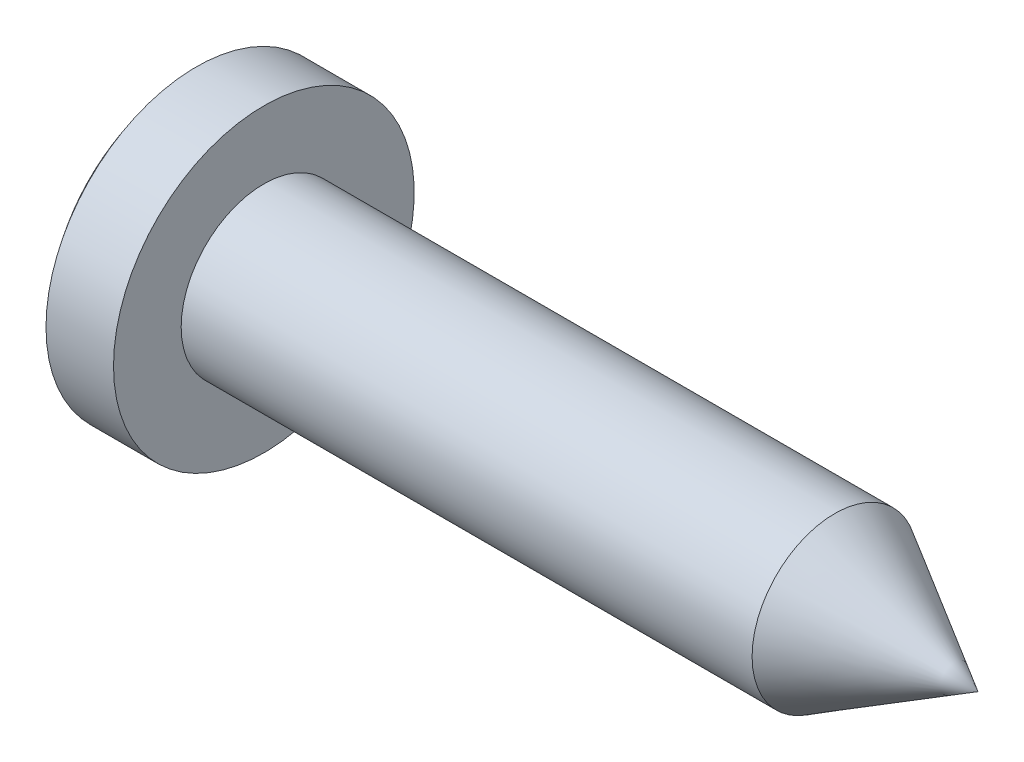
ISO-10303-21;
HEADER;
FILE_DESCRIPTION(('STEP AP214'),'2;1');
FILE_NAME('part.step','',(''),(''),'','','');
FILE_SCHEMA(('AUTOMOTIVE_DESIGN { 1 0 10303 214 1 1 1 1 }'));
ENDSEC;
DATA;
#1=APPLICATION_CONTEXT('core data for automotive mechanical design processes');
#2=APPLICATION_PROTOCOL_DEFINITION('international standard','automotive_design',2000,#1);
#3=PRODUCT_CONTEXT('',#1,'mechanical');
#4=PRODUCT('Part','Part','',(#3));
#5=PRODUCT_RELATED_PRODUCT_CATEGORY('part','',(#4));
#6=PRODUCT_DEFINITION_FORMATION('','',#4);
#7=PRODUCT_DEFINITION_CONTEXT('part definition',#1,'design');
#8=PRODUCT_DEFINITION('design','',#6,#7);
#9=PRODUCT_DEFINITION_SHAPE('','',#8);
#10=(LENGTH_UNIT() NAMED_UNIT(*) SI_UNIT(.MILLI.,.METRE.));
#11=(NAMED_UNIT(*) PLANE_ANGLE_UNIT() SI_UNIT($,.RADIAN.));
#12=(NAMED_UNIT(*) SI_UNIT($,.STERADIAN.) SOLID_ANGLE_UNIT());
#13=UNCERTAINTY_MEASURE_WITH_UNIT(LENGTH_MEASURE(1.E-05),#10,'distance_accuracy_value','');
#14=(GEOMETRIC_REPRESENTATION_CONTEXT(3) GLOBAL_UNCERTAINTY_ASSIGNED_CONTEXT((#13)) GLOBAL_UNIT_ASSIGNED_CONTEXT((#10,
#11,#12)) REPRESENTATION_CONTEXT('',''));
#15=CARTESIAN_POINT('',(0.,0.,0.));
#16=DIRECTION('',(0.,0.,1.));
#17=DIRECTION('',(1.,0.,0.));
#18=AXIS2_PLACEMENT_3D('',#15,#16,#17);
#19=CARTESIAN_POINT('',(1.6,0.,0.));
#20=DIRECTION('',(-1.,0.,0.));
#21=DIRECTION('',(0.,1.,0.));
#22=AXIS2_PLACEMENT_3D('',#19,#20,#21);
#23=SPHERICAL_SURFACE('',#22,3.2);
#24=CARTESIAN_POINT('',(-0.89799919935936,0.,0.));
#25=DIRECTION('',(-1.,0.,0.));
#26=DIRECTION('',(0.,0.,1.));
#27=AXIS2_PLACEMENT_3D('',#24,#25,#26);
#28=CIRCLE('',#27,2.);
#29=CARTESIAN_POINT('',(-0.89799919935936,0.,2.));
#30=VERTEX_POINT('',#29);
#31=EDGE_CURVE('E288',#30,#30,#28,.T.);
#32=ORIENTED_EDGE('',*,*,#31,.T.);
#33=EDGE_LOOP('',(#32));
#34=FACE_BOUND('',#33,.T.);
#35=CARTESIAN_POINT('',(1.56503616117409,0.0806815870157538,0.322726348063015));
#36=DIRECTION('',(0.104528463267654,-0.241206989505463,-0.964827958021851));
#37=DIRECTION('',(0.,0.970142500145332,-0.242535625036333));
#38=AXIS2_PLACEMENT_3D('',#35,#36,#37);
#39=CIRCLE('',#38,3.18247006517847);
#40=CARTESIAN_POINT('',(-1.45274996309991,0.934523397478773,-0.217677932639514));
#41=VERTEX_POINT('',#40);
#42=CARTESIAN_POINT('',(-1.54602165644221,0.569150220513997,-0.136439597205102));
#43=VERTEX_POINT('',#42);
#44=EDGE_CURVE('E11',#41,#43,#39,.F.);
#45=ORIENTED_EDGE('',*,*,#44,.F.);
#46=CARTESIAN_POINT('',(1.66379421431252,0.606961405040142,0.));
#47=DIRECTION('',(0.104528463267654,0.994521895368273,0.));
#48=DIRECTION('',(-0.994521895368273,0.104528463267654,0.));
#49=AXIS2_PLACEMENT_3D('',#46,#47,#48);
#50=CIRCLE('',#49,3.14126219074625);
#51=CARTESIAN_POINT('',(-1.45274996309991,0.934523397478773,0.217677932639514));
#52=VERTEX_POINT('',#51);
#53=EDGE_CURVE('E43',#52,#41,#50,.F.);
#54=ORIENTED_EDGE('',*,*,#53,.F.);
#55=CARTESIAN_POINT('',(1.56503616117409,0.080681587015754,-0.322726348063016));
#56=DIRECTION('',(0.104528463267654,-0.241206989505463,0.964827958021851));
#57=DIRECTION('',(0.,-0.970142500145332,-0.242535625036333));
#58=AXIS2_PLACEMENT_3D('',#55,#56,#57);
#59=CIRCLE('',#58,3.18247006517847);
#60=CARTESIAN_POINT('',(-1.54602165644221,0.569150220513997,0.136439597205102));
#61=VERTEX_POINT('',#60);
#62=EDGE_CURVE('E328',#61,#52,#59,.F.);
#63=ORIENTED_EDGE('',*,*,#62,.F.);
#64=CARTESIAN_POINT('',(1.60749262454255,0.0356437803082177,0.0617368384676572));
#65=DIRECTION('',(0.104528463267654,0.49726094768413,0.861281226008778));
#66=DIRECTION('',(0.,-0.866025403784443,0.499999999999993));
#67=AXIS2_PLACEMENT_3D('',#64,#65,#66);
#68=CIRCLE('',#67,3.19919707806175);
#69=CARTESIAN_POINT('',(-1.57234339721419,0.296847915734236,0.296847915734238));
#70=VERTEX_POINT('',#69);
#71=EDGE_CURVE('E326',#70,#61,#68,.F.);
#72=ORIENTED_EDGE('',*,*,#71,.F.);
#73=CARTESIAN_POINT('',(1.60749262454255,0.0617368384676562,0.035643780308217));
#74=DIRECTION('',(0.104528463267654,0.861281226008779,0.497260947684129));
#75=DIRECTION('',(0.,-0.499999999999992,0.866025403784443));
#76=AXIS2_PLACEMENT_3D('',#73,#74,#75);
#77=CIRCLE('',#76,3.19919707806175);
#78=CARTESIAN_POINT('',(-1.54602165644221,0.136439597205099,0.569150220514));
#79=VERTEX_POINT('',#78);
#80=EDGE_CURVE('E324',#79,#70,#77,.F.);
#81=ORIENTED_EDGE('',*,*,#80,.F.);
#82=CARTESIAN_POINT('',(1.56503616117409,-0.322726348063019,0.0806815870157547));
#83=DIRECTION('',(0.104528463267654,0.964827958021851,-0.241206989505463));
#84=DIRECTION('',(0.,0.242535625036333,0.970142500145332));
#85=AXIS2_PLACEMENT_3D('',#82,#83,#84);
#86=CIRCLE('',#85,3.18247006517847);
#87=CARTESIAN_POINT('',(-1.45274996309991,0.217677932639511,0.934523397478776));
#88=VERTEX_POINT('',#87);
#89=EDGE_CURVE('E322',#88,#79,#86,.F.);
#90=ORIENTED_EDGE('',*,*,#89,.F.);
#91=CARTESIAN_POINT('',(1.66379421431252,0.,0.606961405040145));
#92=DIRECTION('',(0.104528463267654,0.,0.994521895368273));
#93=DIRECTION('',(0.994521895368273,0.,-0.104528463267654));
#94=AXIS2_PLACEMENT_3D('',#91,#92,#93);
#95=CIRCLE('',#94,3.14126219074625);
#96=CARTESIAN_POINT('',(-1.45274996309991,-0.217677932639517,0.934523397478776));
#97=VERTEX_POINT('',#96);
#98=EDGE_CURVE('E320',#97,#88,#95,.F.);
#99=ORIENTED_EDGE('',*,*,#98,.F.);
#100=CARTESIAN_POINT('',(1.56503616117409,0.322726348063014,0.0806815870157536));
#101=DIRECTION('',(0.104528463267654,-0.964827958021851,-0.241206989505463));
#102=DIRECTION('',(0.,0.242535625036333,-0.970142500145332));
#103=AXIS2_PLACEMENT_3D('',#100,#101,#102);
#104=CIRCLE('',#103,3.18247006517847);
#105=CARTESIAN_POINT('',(-1.54602165644221,-0.136439597205105,0.569150220514));
#106=VERTEX_POINT('',#105);
#107=EDGE_CURVE('E318',#106,#97,#104,.F.);
#108=ORIENTED_EDGE('',*,*,#107,.F.);
#109=CARTESIAN_POINT('',(1.60749262454255,-0.0617368384676607,0.0356437803082197));
#110=DIRECTION('',(0.104528463267654,-0.861281226008778,0.49726094768413));
#111=DIRECTION('',(0.,-0.499999999999993,-0.866025403784443));
#112=AXIS2_PLACEMENT_3D('',#109,#110,#111);
#113=CIRCLE('',#112,3.19919707806175);
#114=CARTESIAN_POINT('',(-1.57234339721419,-0.296847915734242,0.296847915734238));
#115=VERTEX_POINT('',#114);
#116=EDGE_CURVE('E316',#115,#106,#113,.F.);
#117=ORIENTED_EDGE('',*,*,#116,.F.);
#118=CARTESIAN_POINT('',(1.60749262454255,-0.035643780308219,0.0617368384676597));
#119=DIRECTION('',(0.104528463267654,-0.497260947684129,0.861281226008779));
#120=DIRECTION('',(0.,-0.866025403784443,-0.499999999999992));
#121=AXIS2_PLACEMENT_3D('',#118,#119,#120);
#122=CIRCLE('',#121,3.19919707806175);
#123=CARTESIAN_POINT('',(-1.54602165644221,-0.569150220514003,0.136439597205102));
#124=VERTEX_POINT('',#123);
#125=EDGE_CURVE('E314',#124,#115,#122,.F.);
#126=ORIENTED_EDGE('',*,*,#125,.F.);
#127=CARTESIAN_POINT('',(1.56503616117409,-0.0806815870157542,-0.322726348063017));
#128=DIRECTION('',(0.104528463267654,0.241206989505463,0.964827958021851));
#129=DIRECTION('',(0.,-0.970142500145332,0.242535625036333));
#130=AXIS2_PLACEMENT_3D('',#127,#128,#129);
#131=CIRCLE('',#130,3.18247006517847);
#132=CARTESIAN_POINT('',(-1.45274996309991,-0.934523397478779,0.217677932639514));
#133=VERTEX_POINT('',#132);
#134=EDGE_CURVE('E312',#133,#124,#131,.F.);
#135=ORIENTED_EDGE('',*,*,#134,.F.);
#136=CARTESIAN_POINT('',(1.66379421431252,-0.606961405040148,0.));
#137=DIRECTION('',(0.104528463267654,-0.994521895368273,0.));
#138=DIRECTION('',(0.994521895368273,0.104528463267654,0.));
#139=AXIS2_PLACEMENT_3D('',#136,#137,#138);
#140=CIRCLE('',#139,3.14126219074625);
#141=CARTESIAN_POINT('',(-1.45274996309991,-0.934523397478779,-0.217677932639514));
#142=VERTEX_POINT('',#141);
#143=EDGE_CURVE('E310',#142,#133,#140,.F.);
#144=ORIENTED_EDGE('',*,*,#143,.F.);
#145=CARTESIAN_POINT('',(1.56503616117409,-0.0806815870157544,0.322726348063017));
#146=DIRECTION('',(0.104528463267654,0.241206989505463,-0.964827958021851));
#147=DIRECTION('',(0.,0.970142500145332,0.242535625036333));
#148=AXIS2_PLACEMENT_3D('',#145,#146,#147);
#149=CIRCLE('',#148,3.18247006517847);
#150=CARTESIAN_POINT('',(-1.54602165644221,-0.569150220514003,-0.136439597205101));
#151=VERTEX_POINT('',#150);
#152=EDGE_CURVE('E308',#151,#142,#149,.F.);
#153=ORIENTED_EDGE('',*,*,#152,.F.);
#154=CARTESIAN_POINT('',(1.60749262454255,-0.0356437803082192,-0.0617368384676598));
#155=DIRECTION('',(0.104528463267654,-0.49726094768413,-0.861281226008778));
#156=DIRECTION('',(0.,0.866025403784443,-0.499999999999993));
#157=AXIS2_PLACEMENT_3D('',#154,#155,#156);
#158=CIRCLE('',#157,3.19919707806175);
#159=CARTESIAN_POINT('',(-1.57234339721419,-0.296847915734242,-0.296847915734238));
#160=VERTEX_POINT('',#159);
#161=EDGE_CURVE('E306',#160,#151,#158,.F.);
#162=ORIENTED_EDGE('',*,*,#161,.F.);
#163=CARTESIAN_POINT('',(1.60749262454255,-0.0617368384676607,-0.0356437803082196));
#164=DIRECTION('',(0.104528463267654,-0.861281226008779,-0.497260947684129));
#165=DIRECTION('',(0.,0.499999999999992,-0.866025403784443));
#166=AXIS2_PLACEMENT_3D('',#163,#164,#165);
#167=CIRCLE('',#166,3.19919707806175);
#168=CARTESIAN_POINT('',(-1.54602165644221,-0.136439597205105,-0.569150220514));
#169=VERTEX_POINT('',#168);
#170=EDGE_CURVE('E304',#169,#160,#167,.F.);
#171=ORIENTED_EDGE('',*,*,#170,.F.);
#172=CARTESIAN_POINT('',(1.56503616117409,0.322726348063013,-0.0806815870157533));
#173=DIRECTION('',(0.104528463267654,-0.964827958021851,0.241206989505463));
#174=DIRECTION('',(0.,-0.242535625036333,-0.970142500145332));
#175=AXIS2_PLACEMENT_3D('',#172,#173,#174);
#176=CIRCLE('',#175,3.18247006517847);
#177=CARTESIAN_POINT('',(-1.45274996309991,-0.217677932639517,-0.934523397478776));
#178=VERTEX_POINT('',#177);
#179=EDGE_CURVE('E302',#178,#169,#176,.F.);
#180=ORIENTED_EDGE('',*,*,#179,.F.);
#181=CARTESIAN_POINT('',(1.66379421431252,0.,-0.606961405040145));
#182=DIRECTION('',(0.104528463267654,0.,-0.994521895368273));
#183=DIRECTION('',(-0.994521895368273,0.,-0.104528463267654));
#184=AXIS2_PLACEMENT_3D('',#181,#182,#183);
#185=CIRCLE('',#184,3.14126219074625);
#186=CARTESIAN_POINT('',(-1.45274996309991,0.217677932639511,-0.934523397478776));
#187=VERTEX_POINT('',#186);
#188=EDGE_CURVE('E300',#187,#178,#185,.F.);
#189=ORIENTED_EDGE('',*,*,#188,.F.);
#190=CARTESIAN_POINT('',(1.56503616117409,-0.322726348063019,-0.0806815870157549));
#191=DIRECTION('',(0.104528463267654,0.964827958021851,0.241206989505463));
#192=DIRECTION('',(0.,-0.242535625036333,0.970142500145332));
#193=AXIS2_PLACEMENT_3D('',#190,#191,#192);
#194=CIRCLE('',#193,3.18247006517847);
#195=CARTESIAN_POINT('',(-1.54602165644221,0.136439597205099,-0.569150220514));
#196=VERTEX_POINT('',#195);
#197=EDGE_CURVE('E298',#196,#187,#194,.F.);
#198=ORIENTED_EDGE('',*,*,#197,.F.);
#199=CARTESIAN_POINT('',(1.60749262454255,0.0617368384676562,-0.0356437803082171));
#200=DIRECTION('',(0.104528463267654,0.861281226008778,-0.49726094768413));
#201=DIRECTION('',(0.,0.499999999999993,0.866025403784443));
#202=AXIS2_PLACEMENT_3D('',#199,#200,#201);
#203=CIRCLE('',#202,3.19919707806175);
#204=CARTESIAN_POINT('',(-1.57234339721419,0.296847915734236,-0.296847915734239));
#205=VERTEX_POINT('',#204);
#206=EDGE_CURVE('E296',#205,#196,#203,.F.);
#207=ORIENTED_EDGE('',*,*,#206,.F.);
#208=CARTESIAN_POINT('',(1.60749262454255,0.0356437803082175,-0.0617368384676571));
#209=DIRECTION('',(0.104528463267654,0.497260947684129,-0.861281226008778));
#210=DIRECTION('',(0.,0.866025403784443,0.499999999999992));
#211=AXIS2_PLACEMENT_3D('',#208,#209,#210);
#212=CIRCLE('',#211,3.19919707806175);
#213=EDGE_CURVE('E294',#43,#205,#212,.F.);
#214=ORIENTED_EDGE('',*,*,#213,.F.);
#215=EDGE_LOOP('',(#45,#54,#63,#72,#81,#90,#99,#108,#117,#126,#135,#144,#153,#162,#171,#180,
#189,#198,#207,#214));
#216=FACE_BOUND('',#215,.T.);
#217=ADVANCED_FACE('F35',(#34,#216),#23,.T.);
#218=CARTESIAN_POINT('',(0.,0.,0.));
#219=DIRECTION('',(-1.,0.,0.));
#220=DIRECTION('',(0.,0.,1.));
#221=AXIS2_PLACEMENT_3D('',#218,#219,#220);
#222=CYLINDRICAL_SURFACE('',#221,1.1);
#223=CARTESIAN_POINT('',(0.,0.,0.));
#224=DIRECTION('',(-1.,0.,0.));
#225=DIRECTION('',(0.,0.,1.));
#226=AXIS2_PLACEMENT_3D('',#223,#224,#225);
#227=CIRCLE('',#226,1.1);
#228=CARTESIAN_POINT('',(0.,0.,1.1));
#229=VERTEX_POINT('',#228);
#230=EDGE_CURVE('E195',#229,#229,#227,.T.);
#231=ORIENTED_EDGE('',*,*,#230,.F.);
#232=EDGE_LOOP('',(#231));
#233=FACE_BOUND('',#232,.T.);
#234=CARTESIAN_POINT('',(7.59474411167421,0.,0.));
#235=DIRECTION('',(-1.,0.,0.));
#236=DIRECTION('',(0.,0.,1.));
#237=AXIS2_PLACEMENT_3D('',#234,#235,#236);
#238=CIRCLE('',#237,1.1);
#239=CARTESIAN_POINT('',(7.59474411167421,0.,1.1));
#240=VERTEX_POINT('',#239);
#241=EDGE_CURVE('E191',#240,#240,#238,.T.);
#242=ORIENTED_EDGE('',*,*,#241,.T.);
#243=EDGE_LOOP('',(#242));
#244=FACE_BOUND('',#243,.T.);
#245=ADVANCED_FACE('F424',(#233,#244),#222,.T.);
#246=CARTESIAN_POINT('',(0.,1.1,0.));
#247=DIRECTION('',(-1.,0.,0.));
#248=DIRECTION('',(0.,0.,1.));
#249=AXIS2_PLACEMENT_3D('',#246,#247,#248);
#250=PLANE('',#249);
#251=CARTESIAN_POINT('',(0.,0.,0.));
#252=DIRECTION('',(-1.,0.,0.));
#253=DIRECTION('',(0.,0.,1.));
#254=AXIS2_PLACEMENT_3D('',#251,#252,#253);
#255=CIRCLE('',#254,2.);
#256=CARTESIAN_POINT('',(0.,0.,2.));
#257=VERTEX_POINT('',#256);
#258=EDGE_CURVE('E291',#257,#257,#255,.T.);
#259=ORIENTED_EDGE('',*,*,#258,.F.);
#260=EDGE_LOOP('',(#259));
#261=FACE_BOUND('',#260,.T.);
#262=ORIENTED_EDGE('',*,*,#230,.T.);
#263=EDGE_LOOP('',(#262));
#264=FACE_BOUND('',#263,.T.);
#265=ADVANCED_FACE('F37',(#261,#264),#250,.F.);
#266=CARTESIAN_POINT('',(0.,0.,0.));
#267=DIRECTION('',(-1.,0.,0.));
#268=DIRECTION('',(0.,0.,1.));
#269=AXIS2_PLACEMENT_3D('',#266,#267,#268);
#270=CYLINDRICAL_SURFACE('',#269,2.);
#271=ORIENTED_EDGE('',*,*,#31,.F.);
#272=EDGE_LOOP('',(#271));
#273=FACE_BOUND('',#272,.T.);
#274=ORIENTED_EDGE('',*,*,#258,.T.);
#275=EDGE_LOOP('',(#274));
#276=FACE_BOUND('',#275,.T.);
#277=ADVANCED_FACE('F433',(#273,#276),#270,.T.);
#278=CARTESIAN_POINT('',(7.59474411167421,0.,0.));
#279=DIRECTION('',(-1.,0.,0.));
#280=DIRECTION('',(0.,0.,1.));
#281=AXIS2_PLACEMENT_3D('',#278,#279,#280);
#282=CONICAL_SURFACE('',#281,1.1,0.523598775598293);
#283=CARTESIAN_POINT('',(9.5,0.,0.));
#284=VERTEX_POINT('',#283);
#285=VERTEX_LOOP('',#284);
#286=FACE_BOUND('',#285,.T.);
#287=ORIENTED_EDGE('',*,*,#241,.F.);
#288=EDGE_LOOP('',(#287));
#289=FACE_BOUND('',#288,.T.);
#290=ADVANCED_FACE('F435',(#286,#289),#282,.T.);
#291=CARTESIAN_POINT('',(-1.6,0.95,-0.2375));
#292=DIRECTION('',(0.104528463267654,-0.241206989505463,-0.964827958021851));
#293=DIRECTION('',(0.,0.970142500145332,-0.242535625036333));
#294=AXIS2_PLACEMENT_3D('',#291,#292,#293);
#295=PLANE('',#294);
#296=ORIENTED_EDGE('',*,*,#44,.T.);
#297=DIRECTION('',(-0.993634572314887,0.0156427600493606,-0.111560032084303));
#298=VECTOR('',#297,1.);
#299=CARTESIAN_POINT('',(-1.6,0.57,-0.1425));
#300=LINE('',#299,#298);
#301=CARTESIAN_POINT('',(-0.75,0.556618474827239,-0.0470664976705276));
#302=VERTEX_POINT('',#301);
#303=EDGE_CURVE('E50',#302,#43,#300,.T.);
#304=ORIENTED_EDGE('',*,*,#303,.F.);
#305=DIRECTION('',(0.,-0.970142500145332,0.242535625036333));
#306=VECTOR('',#305,1.);
#307=CARTESIAN_POINT('',(-0.75,0.0216677931850052,0.086671172740031));
#308=LINE('',#307,#306);
#309=CARTESIAN_POINT('',(-0.75,0.860661400024174,-0.123077228969761));
#310=VERTEX_POINT('',#309);
#311=EDGE_CURVE('E175',#302,#310,#308,.F.);
#312=ORIENTED_EDGE('',*,*,#311,.T.);
#313=DIRECTION('',(-0.985727427293419,0.103604127426078,-0.132693722013437));
#314=VECTOR('',#313,1.);
#315=CARTESIAN_POINT('',(-1.53787007542131,0.943469881790042,-0.229136378665655));
#316=LINE('',#315,#314);
#317=EDGE_CURVE('E186',#310,#41,#316,.T.);
#318=ORIENTED_EDGE('',*,*,#317,.T.);
#319=EDGE_LOOP('',(#296,#304,#312,#318));
#320=FACE_BOUND('',#319,.T.);
#321=ADVANCED_FACE('F185',(#320),#295,.F.);
#322=CARTESIAN_POINT('',(-1.6,0.95,0.2375));
#323=DIRECTION('',(0.104528463267654,0.994521895368273,0.));
#324=DIRECTION('',(-0.994521895368273,0.104528463267654,0.));
#325=AXIS2_PLACEMENT_3D('',#322,#323,#324);
#326=PLANE('',#325);
#327=ORIENTED_EDGE('',*,*,#53,.T.);
#328=ORIENTED_EDGE('',*,*,#317,.F.);
#329=DIRECTION('',(0.,0.,-1.));
#330=VECTOR('',#329,1.);
#331=CARTESIAN_POINT('',(-0.75,0.860661400024174,0.));
#332=LINE('',#331,#330);
#333=CARTESIAN_POINT('',(-0.75,0.860661400024174,0.123077228969761));
#334=VERTEX_POINT('',#333);
#335=EDGE_CURVE('E171',#310,#334,#332,.F.);
#336=ORIENTED_EDGE('',*,*,#335,.T.);
#337=DIRECTION('',(-0.985727427293418,0.103604127426078,0.132693722013437));
#338=VECTOR('',#337,1.);
#339=CARTESIAN_POINT('',(-1.6,0.95,0.2375));
#340=LINE('',#339,#338);
#341=EDGE_CURVE('E192',#334,#52,#340,.T.);
#342=ORIENTED_EDGE('',*,*,#341,.T.);
#343=EDGE_LOOP('',(#327,#328,#336,#342));
#344=FACE_BOUND('',#343,.T.);
#345=ADVANCED_FACE('F189',(#344),#326,.F.);
#346=CARTESIAN_POINT('',(-1.6,0.95,0.2375));
#347=DIRECTION('',(0.104528463267654,-0.241206989505463,0.964827958021851));
#348=DIRECTION('',(0.,-0.970142500145332,-0.242535625036333));
#349=AXIS2_PLACEMENT_3D('',#346,#347,#348);
#350=PLANE('',#349);
#351=ORIENTED_EDGE('',*,*,#62,.T.);
#352=ORIENTED_EDGE('',*,*,#341,.F.);
#353=DIRECTION('',(0.,0.970142500145332,0.242535625036333));
#354=VECTOR('',#353,1.);
#355=CARTESIAN_POINT('',(-0.75,0.0216677931850056,-0.0866711727400315));
#356=LINE('',#355,#354);
#357=CARTESIAN_POINT('',(-0.75,0.556618474827239,0.0470664976705271));
#358=VERTEX_POINT('',#357);
#359=EDGE_CURVE('E177',#334,#358,#356,.F.);
#360=ORIENTED_EDGE('',*,*,#359,.T.);
#361=DIRECTION('',(-0.993634572314886,0.0156427600493606,0.111560032084303));
#362=VECTOR('',#361,1.);
#363=CARTESIAN_POINT('',(-1.61643715208567,0.57025876960518,0.144345476461009));
#364=LINE('',#363,#362);
#365=EDGE_CURVE('E197',#358,#61,#364,.T.);
#366=ORIENTED_EDGE('',*,*,#365,.T.);
#367=EDGE_LOOP('',(#351,#352,#360,#366));
#368=FACE_BOUND('',#367,.T.);
#369=ADVANCED_FACE('F331',(#368),#350,.F.);
#370=CARTESIAN_POINT('',(-1.6,0.57,0.1425));
#371=DIRECTION('',(0.104528463267654,0.49726094768413,0.861281226008778));
#372=DIRECTION('',(0.,-0.866025403784443,0.499999999999993));
#373=AXIS2_PLACEMENT_3D('',#370,#371,#372);
#374=PLANE('',#373);
#375=ORIENTED_EDGE('',*,*,#71,.T.);
#376=ORIENTED_EDGE('',*,*,#365,.F.);
#377=DIRECTION('',(0.,0.866025403784443,-0.499999999999993));
#378=VECTOR('',#377,1.);
#379=CARTESIAN_POINT('',(-0.75,0.159535010031723,0.276322742960964));
#380=LINE('',#379,#378);
#381=CARTESIAN_POINT('',(-0.75,0.233575465858468,0.233575465858471));
#382=VERTEX_POINT('',#381);
#383=EDGE_CURVE('E253',#358,#382,#380,.F.);
#384=ORIENTED_EDGE('',*,*,#383,.T.);
#385=DIRECTION('',(-0.994132040497618,0.0764901498757907,0.0764901498757906));
#386=VECTOR('',#385,1.);
#387=CARTESIAN_POINT('',(-1.60871040111109,0.299646052667047,0.299646052667049));
#388=LINE('',#387,#386);
#389=EDGE_CURVE('E247',#382,#70,#388,.T.);
#390=ORIENTED_EDGE('',*,*,#389,.T.);
#391=EDGE_LOOP('',(#375,#376,#384,#390));
#392=FACE_BOUND('',#391,.T.);
#393=ADVANCED_FACE('F414',(#392),#374,.F.);
#394=CARTESIAN_POINT('',(-1.6,0.142499999999997,0.570000000000003));
#395=DIRECTION('',(0.104528463267654,0.861281226008779,0.497260947684129));
#396=DIRECTION('',(0.,-0.499999999999992,0.866025403784443));
#397=AXIS2_PLACEMENT_3D('',#394,#395,#396);
#398=PLANE('',#397);
#399=ORIENTED_EDGE('',*,*,#80,.T.);
#400=ORIENTED_EDGE('',*,*,#389,.F.);
#401=DIRECTION('',(0.,0.499999999999992,-0.866025403784443));
#402=VECTOR('',#401,1.);
#403=CARTESIAN_POINT('',(-0.75,0.276322742960961,0.159535010031725));
#404=LINE('',#403,#402);
#405=CARTESIAN_POINT('',(-0.75,0.0470664976705244,0.556618474827243));
#406=VERTEX_POINT('',#405);
#407=EDGE_CURVE('E255',#382,#406,#404,.F.);
#408=ORIENTED_EDGE('',*,*,#407,.T.);
#409=DIRECTION('',(-0.993634572314887,0.111560032084303,0.0156427600493606));
#410=VECTOR('',#409,1.);
#411=CARTESIAN_POINT('',(-1.6,0.142499999999997,0.570000000000003));
#412=LINE('',#411,#410);
#413=EDGE_CURVE('E244',#406,#79,#412,.T.);
#414=ORIENTED_EDGE('',*,*,#413,.T.);
#415=EDGE_LOOP('',(#399,#400,#408,#414));
#416=FACE_BOUND('',#415,.T.);
#417=ADVANCED_FACE('F411',(#416),#398,.F.);
#418=CARTESIAN_POINT('',(-1.6,0.237499999999997,0.950000000000003));
#419=DIRECTION('',(0.104528463267654,0.964827958021851,-0.241206989505463));
#420=DIRECTION('',(0.,0.242535625036333,0.970142500145332));
#421=AXIS2_PLACEMENT_3D('',#418,#419,#420);
#422=PLANE('',#421);
#423=ORIENTED_EDGE('',*,*,#89,.T.);
#424=ORIENTED_EDGE('',*,*,#413,.F.);
#425=DIRECTION('',(0.,-0.242535625036333,-0.970142500145332));
#426=VECTOR('',#425,1.);
#427=CARTESIAN_POINT('',(-0.75,-0.0866711727400341,0.0216677931850083));
#428=LINE('',#427,#426);
#429=CARTESIAN_POINT('',(-0.75,0.123077228969758,0.860661400024177));
#430=VERTEX_POINT('',#429);
#431=EDGE_CURVE('E257',#406,#430,#428,.F.);
#432=ORIENTED_EDGE('',*,*,#431,.T.);
#433=DIRECTION('',(-0.985727427293419,0.132693722013437,0.103604127426078));
#434=VECTOR('',#433,1.);
#435=CARTESIAN_POINT('',(-1.53787007542131,0.229136378665652,0.943469881790045));
#436=LINE('',#435,#434);
#437=EDGE_CURVE('E241',#430,#88,#436,.T.);
#438=ORIENTED_EDGE('',*,*,#437,.T.);
#439=EDGE_LOOP('',(#423,#424,#432,#438));
#440=FACE_BOUND('',#439,.T.);
#441=ADVANCED_FACE('F408',(#440),#422,.F.);
#442=CARTESIAN_POINT('',(-1.6,-0.237500000000003,0.950000000000003));
#443=DIRECTION('',(0.104528463267654,0.,0.994521895368273));
#444=DIRECTION('',(0.994521895368273,0.,-0.104528463267654));
#445=AXIS2_PLACEMENT_3D('',#442,#443,#444);
#446=PLANE('',#445);
#447=ORIENTED_EDGE('',*,*,#98,.T.);
#448=ORIENTED_EDGE('',*,*,#437,.F.);
#449=DIRECTION('',(0.,1.,0.));
#450=VECTOR('',#449,1.);
#451=CARTESIAN_POINT('',(-0.75,0.,0.860661400024177));
#452=LINE('',#451,#450);
#453=CARTESIAN_POINT('',(-0.75,-0.123077228969764,0.860661400024177));
#454=VERTEX_POINT('',#453);
#455=EDGE_CURVE('E259',#430,#454,#452,.F.);
#456=ORIENTED_EDGE('',*,*,#455,.T.);
#457=DIRECTION('',(-0.985727427293418,-0.132693722013437,0.103604127426078));
#458=VECTOR('',#457,1.);
#459=CARTESIAN_POINT('',(-1.6,-0.237500000000003,0.950000000000003));
#460=LINE('',#459,#458);
#461=EDGE_CURVE('E238',#454,#97,#460,.T.);
#462=ORIENTED_EDGE('',*,*,#461,.T.);
#463=EDGE_LOOP('',(#447,#448,#456,#462));
#464=FACE_BOUND('',#463,.T.);
#465=ADVANCED_FACE('F401',(#464),#446,.F.);
#466=CARTESIAN_POINT('',(-1.6,-0.237500000000003,0.950000000000003));
#467=DIRECTION('',(0.104528463267654,-0.964827958021851,-0.241206989505463));
#468=DIRECTION('',(0.,0.242535625036333,-0.970142500145332));
#469=AXIS2_PLACEMENT_3D('',#466,#467,#468);
#470=PLANE('',#469);
#471=ORIENTED_EDGE('',*,*,#107,.T.);
#472=ORIENTED_EDGE('',*,*,#461,.F.);
#473=DIRECTION('',(0.,-0.242535625036333,0.970142500145332));
#474=VECTOR('',#473,1.);
#475=CARTESIAN_POINT('',(-0.75,0.0866711727400286,0.0216677931850082));
#476=LINE('',#475,#474);
#477=CARTESIAN_POINT('',(-0.75,-0.0470664976705303,0.556618474827242));
#478=VERTEX_POINT('',#477);
#479=EDGE_CURVE('E261',#454,#478,#476,.F.);
#480=ORIENTED_EDGE('',*,*,#479,.T.);
#481=DIRECTION('',(-0.993634572314886,-0.111560032084303,0.0156427600493606));
#482=VECTOR('',#481,1.);
#483=CARTESIAN_POINT('',(-1.61643715208567,-0.144345476461012,0.570258769605183));
#484=LINE('',#483,#482);
#485=EDGE_CURVE('E235',#478,#106,#484,.T.);
#486=ORIENTED_EDGE('',*,*,#485,.T.);
#487=EDGE_LOOP('',(#471,#472,#480,#486));
#488=FACE_BOUND('',#487,.T.);
#489=ADVANCED_FACE('F399',(#488),#470,.F.);
#490=CARTESIAN_POINT('',(-1.6,-0.142500000000003,0.570000000000003));
#491=DIRECTION('',(0.104528463267654,-0.861281226008778,0.49726094768413));
#492=DIRECTION('',(0.,-0.499999999999993,-0.866025403784443));
#493=AXIS2_PLACEMENT_3D('',#490,#491,#492);
#494=PLANE('',#493);
#495=ORIENTED_EDGE('',*,*,#116,.T.);
#496=ORIENTED_EDGE('',*,*,#485,.F.);
#497=DIRECTION('',(0.,0.499999999999993,0.866025403784443));
#498=VECTOR('',#497,1.);
#499=CARTESIAN_POINT('',(-0.75,-0.276322742960967,0.159535010031726));
#500=LINE('',#499,#498);
#501=CARTESIAN_POINT('',(-0.75,-0.233575465858474,0.233575465858471));
#502=VERTEX_POINT('',#501);
#503=EDGE_CURVE('E263',#478,#502,#500,.F.);
#504=ORIENTED_EDGE('',*,*,#503,.T.);
#505=DIRECTION('',(-0.994132040497618,-0.0764901498757906,0.0764901498757907));
#506=VECTOR('',#505,1.);
#507=CARTESIAN_POINT('',(-1.60871040111109,-0.299646052667052,0.299646052667049));
#508=LINE('',#507,#506);
#509=EDGE_CURVE('E232',#502,#115,#508,.T.);
#510=ORIENTED_EDGE('',*,*,#509,.T.);
#511=EDGE_LOOP('',(#495,#496,#504,#510));
#512=FACE_BOUND('',#511,.T.);
#513=ADVANCED_FACE('F392',(#512),#494,.F.);
#514=CARTESIAN_POINT('',(-1.6,-0.570000000000006,0.1425));
#515=DIRECTION('',(0.104528463267654,-0.497260947684129,0.861281226008779));
#516=DIRECTION('',(0.,-0.866025403784443,-0.499999999999992));
#517=AXIS2_PLACEMENT_3D('',#514,#515,#516);
#518=PLANE('',#517);
#519=ORIENTED_EDGE('',*,*,#125,.T.);
#520=ORIENTED_EDGE('',*,*,#509,.F.);
#521=DIRECTION('',(0.,0.866025403784443,0.499999999999992));
#522=VECTOR('',#521,1.);
#523=CARTESIAN_POINT('',(-0.75,-0.159535010031727,0.276322742960964));
#524=LINE('',#523,#522);
#525=CARTESIAN_POINT('',(-0.75,-0.556618474827246,0.0470664976705275));
#526=VERTEX_POINT('',#525);
#527=EDGE_CURVE('E265',#502,#526,#524,.F.);
#528=ORIENTED_EDGE('',*,*,#527,.T.);
#529=DIRECTION('',(-0.993634572314887,-0.0156427600493606,0.111560032084303));
#530=VECTOR('',#529,1.);
#531=CARTESIAN_POINT('',(-1.6,-0.570000000000006,0.1425));
#532=LINE('',#531,#530);
#533=EDGE_CURVE('E229',#526,#124,#532,.T.);
#534=ORIENTED_EDGE('',*,*,#533,.T.);
#535=EDGE_LOOP('',(#519,#520,#528,#534));
#536=FACE_BOUND('',#535,.T.);
#537=ADVANCED_FACE('F389',(#536),#518,.F.);
#538=CARTESIAN_POINT('',(-1.6,-0.950000000000006,0.2375));
#539=DIRECTION('',(0.104528463267654,0.241206989505463,0.964827958021851));
#540=DIRECTION('',(0.,-0.970142500145332,0.242535625036333));
#541=AXIS2_PLACEMENT_3D('',#538,#539,#540);
#542=PLANE('',#541);
#543=ORIENTED_EDGE('',*,*,#134,.T.);
#544=ORIENTED_EDGE('',*,*,#533,.F.);
#545=DIRECTION('',(0.,0.970142500145332,-0.242535625036333));
#546=VECTOR('',#545,1.);
#547=CARTESIAN_POINT('',(-0.75,-0.0216677931850104,-0.0866711727400313));
#548=LINE('',#547,#546);
#549=CARTESIAN_POINT('',(-0.75,-0.86066140002418,0.123077228969761));
#550=VERTEX_POINT('',#549);
#551=EDGE_CURVE('E267',#526,#550,#548,.F.);
#552=ORIENTED_EDGE('',*,*,#551,.T.);
#553=DIRECTION('',(-0.985727427293419,-0.103604127426078,0.132693722013437));
#554=VECTOR('',#553,1.);
#555=CARTESIAN_POINT('',(-1.53787007542131,-0.943469881790048,0.229136378665655));
#556=LINE('',#555,#554);
#557=EDGE_CURVE('E226',#550,#133,#556,.T.);
#558=ORIENTED_EDGE('',*,*,#557,.T.);
#559=EDGE_LOOP('',(#543,#544,#552,#558));
#560=FACE_BOUND('',#559,.T.);
#561=ADVANCED_FACE('F381',(#560),#542,.F.);
#562=CARTESIAN_POINT('',(-1.6,-0.950000000000006,-0.2375));
#563=DIRECTION('',(0.104528463267654,-0.994521895368273,0.));
#564=DIRECTION('',(0.994521895368273,0.104528463267654,0.));
#565=AXIS2_PLACEMENT_3D('',#562,#563,#564);
#566=PLANE('',#565);
#567=ORIENTED_EDGE('',*,*,#143,.T.);
#568=ORIENTED_EDGE('',*,*,#557,.F.);
#569=DIRECTION('',(0.,0.,1.));
#570=VECTOR('',#569,1.);
#571=CARTESIAN_POINT('',(-0.75,-0.86066140002418,0.));
#572=LINE('',#571,#570);
#573=CARTESIAN_POINT('',(-0.75,-0.86066140002418,-0.123077228969761));
#574=VERTEX_POINT('',#573);
#575=EDGE_CURVE('E269',#550,#574,#572,.F.);
#576=ORIENTED_EDGE('',*,*,#575,.T.);
#577=DIRECTION('',(-0.985727427293418,-0.103604127426078,-0.132693722013437));
#578=VECTOR('',#577,1.);
#579=CARTESIAN_POINT('',(-1.6,-0.950000000000006,-0.2375));
#580=LINE('',#579,#578);
#581=EDGE_CURVE('E223',#574,#142,#580,.T.);
#582=ORIENTED_EDGE('',*,*,#581,.T.);
#583=EDGE_LOOP('',(#567,#568,#576,#582));
#584=FACE_BOUND('',#583,.T.);
#585=ADVANCED_FACE('F379',(#584),#566,.F.);
#586=CARTESIAN_POINT('',(-1.6,-0.950000000000006,-0.2375));
#587=DIRECTION('',(0.104528463267654,0.241206989505463,-0.964827958021851));
#588=DIRECTION('',(0.,0.970142500145332,0.242535625036333));
#589=AXIS2_PLACEMENT_3D('',#586,#587,#588);
#590=PLANE('',#589);
#591=ORIENTED_EDGE('',*,*,#152,.T.);
#592=ORIENTED_EDGE('',*,*,#581,.F.);
#593=DIRECTION('',(0.,-0.970142500145332,-0.242535625036333));
#594=VECTOR('',#593,1.);
#595=CARTESIAN_POINT('',(-0.75,-0.0216677931850103,0.0866711727400319));
#596=LINE('',#595,#594);
#597=CARTESIAN_POINT('',(-0.75,-0.556618474827245,-0.0470664976705272));
#598=VERTEX_POINT('',#597);
#599=EDGE_CURVE('E271',#574,#598,#596,.F.);
#600=ORIENTED_EDGE('',*,*,#599,.T.);
#601=DIRECTION('',(-0.993634572314886,-0.0156427600493606,-0.111560032084303));
#602=VECTOR('',#601,1.);
#603=CARTESIAN_POINT('',(-1.61643715208567,-0.570258769605186,-0.144345476461009));
#604=LINE('',#603,#602);
#605=EDGE_CURVE('E220',#598,#151,#604,.T.);
#606=ORIENTED_EDGE('',*,*,#605,.T.);
#607=EDGE_LOOP('',(#591,#592,#600,#606));
#608=FACE_BOUND('',#607,.T.);
#609=ADVANCED_FACE('F372',(#608),#590,.F.);
#610=CARTESIAN_POINT('',(-1.6,-0.570000000000006,-0.1425));
#611=DIRECTION('',(0.104528463267654,-0.49726094768413,-0.861281226008778));
#612=DIRECTION('',(0.,0.866025403784443,-0.499999999999993));
#613=AXIS2_PLACEMENT_3D('',#610,#611,#612);
#614=PLANE('',#613);
#615=ORIENTED_EDGE('',*,*,#161,.T.);
#616=ORIENTED_EDGE('',*,*,#605,.F.);
#617=DIRECTION('',(0.,-0.866025403784443,0.499999999999993));
#618=VECTOR('',#617,1.);
#619=CARTESIAN_POINT('',(-0.75,-0.159535010031728,-0.276322742960964));
#620=LINE('',#619,#618);
#621=CARTESIAN_POINT('',(-0.75,-0.233575465858474,-0.233575465858471));
#622=VERTEX_POINT('',#621);
#623=EDGE_CURVE('E273',#598,#622,#620,.F.);
#624=ORIENTED_EDGE('',*,*,#623,.T.);
#625=DIRECTION('',(-0.994132040497618,-0.0764901498757907,-0.0764901498757906));
#626=VECTOR('',#625,1.);
#627=CARTESIAN_POINT('',(-1.60871040111109,-0.299646052667052,-0.299646052667049));
#628=LINE('',#627,#626);
#629=EDGE_CURVE('E217',#622,#160,#628,.T.);
#630=ORIENTED_EDGE('',*,*,#629,.T.);
#631=EDGE_LOOP('',(#615,#616,#624,#630));
#632=FACE_BOUND('',#631,.T.);
#633=ADVANCED_FACE('F369',(#632),#614,.F.);
#634=CARTESIAN_POINT('',(-1.6,-0.142500000000003,-0.570000000000003));
#635=DIRECTION('',(0.104528463267654,-0.861281226008779,-0.497260947684129));
#636=DIRECTION('',(0.,0.499999999999992,-0.866025403784443));
#637=AXIS2_PLACEMENT_3D('',#634,#635,#636);
#638=PLANE('',#637);
#639=ORIENTED_EDGE('',*,*,#170,.T.);
#640=ORIENTED_EDGE('',*,*,#629,.F.);
#641=DIRECTION('',(0.,-0.499999999999992,0.866025403784443));
#642=VECTOR('',#641,1.);
#643=CARTESIAN_POINT('',(-0.75,-0.276322742960967,-0.159535010031725));
#644=LINE('',#643,#642);
#645=CARTESIAN_POINT('',(-0.75,-0.0470664976705306,-0.556618474827243));
#646=VERTEX_POINT('',#645);
#647=EDGE_CURVE('E275',#622,#646,#644,.F.);
#648=ORIENTED_EDGE('',*,*,#647,.T.);
#649=DIRECTION('',(-0.993634572314887,-0.111560032084303,-0.0156427600493606));
#650=VECTOR('',#649,1.);
#651=CARTESIAN_POINT('',(-1.6,-0.142500000000003,-0.570000000000003));
#652=LINE('',#651,#650);
#653=EDGE_CURVE('E214',#646,#169,#652,.T.);
#654=ORIENTED_EDGE('',*,*,#653,.T.);
#655=EDGE_LOOP('',(#639,#640,#648,#654));
#656=FACE_BOUND('',#655,.T.);
#657=ADVANCED_FACE('F361',(#656),#638,.F.);
#658=CARTESIAN_POINT('',(-1.6,-0.237500000000003,-0.950000000000003));
#659=DIRECTION('',(0.104528463267654,-0.964827958021851,0.241206989505463));
#660=DIRECTION('',(0.,-0.242535625036333,-0.970142500145332));
#661=AXIS2_PLACEMENT_3D('',#658,#659,#660);
#662=PLANE('',#661);
#663=ORIENTED_EDGE('',*,*,#179,.T.);
#664=ORIENTED_EDGE('',*,*,#653,.F.);
#665=DIRECTION('',(0.,0.242535625036333,0.970142500145332));
#666=VECTOR('',#665,1.);
#667=CARTESIAN_POINT('',(-0.75,0.0866711727400283,-0.0216677931850072));
#668=LINE('',#667,#666);
#669=CARTESIAN_POINT('',(-0.75,-0.123077228969764,-0.860661400024177));
#670=VERTEX_POINT('',#669);
#671=EDGE_CURVE('E277',#646,#670,#668,.F.);
#672=ORIENTED_EDGE('',*,*,#671,.T.);
#673=DIRECTION('',(-0.985727427293418,-0.132693722013437,-0.103604127426078));
#674=VECTOR('',#673,1.);
#675=CARTESIAN_POINT('',(-1.53787007542131,-0.229136378665658,-0.943469881790045));
#676=LINE('',#675,#674);
#677=EDGE_CURVE('E211',#670,#178,#676,.T.);
#678=ORIENTED_EDGE('',*,*,#677,.T.);
#679=EDGE_LOOP('',(#663,#664,#672,#678));
#680=FACE_BOUND('',#679,.T.);
#681=ADVANCED_FACE('F359',(#680),#662,.F.);
#682=CARTESIAN_POINT('',(-1.6,0.237499999999997,-0.950000000000003));
#683=DIRECTION('',(0.104528463267654,0.,-0.994521895368273));
#684=DIRECTION('',(-0.994521895368273,0.,-0.104528463267654));
#685=AXIS2_PLACEMENT_3D('',#682,#683,#684);
#686=PLANE('',#685);
#687=ORIENTED_EDGE('',*,*,#188,.T.);
#688=ORIENTED_EDGE('',*,*,#677,.F.);
#689=DIRECTION('',(0.,-1.,0.));
#690=VECTOR('',#689,1.);
#691=CARTESIAN_POINT('',(-0.75,0.,-0.860661400024177));
#692=LINE('',#691,#690);
#693=CARTESIAN_POINT('',(-0.75,0.123077228969758,-0.860661400024177));
#694=VERTEX_POINT('',#693);
#695=EDGE_CURVE('E279',#670,#694,#692,.F.);
#696=ORIENTED_EDGE('',*,*,#695,.T.);
#697=DIRECTION('',(-0.985727427293418,0.132693722013437,-0.103604127426078));
#698=VECTOR('',#697,1.);
#699=CARTESIAN_POINT('',(-1.6,0.237499999999997,-0.950000000000003));
#700=LINE('',#699,#698);
#701=EDGE_CURVE('E208',#694,#187,#700,.T.);
#702=ORIENTED_EDGE('',*,*,#701,.T.);
#703=EDGE_LOOP('',(#687,#688,#696,#702));
#704=FACE_BOUND('',#703,.T.);
#705=ADVANCED_FACE('F352',(#704),#686,.F.);
#706=CARTESIAN_POINT('',(-1.6,0.237499999999997,-0.950000000000003));
#707=DIRECTION('',(0.104528463267654,0.964827958021851,0.241206989505463));
#708=DIRECTION('',(0.,-0.242535625036333,0.970142500145332));
#709=AXIS2_PLACEMENT_3D('',#706,#707,#708);
#710=PLANE('',#709);
#711=ORIENTED_EDGE('',*,*,#197,.T.);
#712=ORIENTED_EDGE('',*,*,#701,.F.);
#713=DIRECTION('',(0.,0.242535625036333,-0.970142500145332));
#714=VECTOR('',#713,1.);
#715=CARTESIAN_POINT('',(-0.75,-0.0866711727400348,-0.0216677931850077));
#716=LINE('',#715,#714);
#717=CARTESIAN_POINT('',(-0.75,0.0470664976705241,-0.556618474827242));
#718=VERTEX_POINT('',#717);
#719=EDGE_CURVE('E281',#694,#718,#716,.F.);
#720=ORIENTED_EDGE('',*,*,#719,.T.);
#721=DIRECTION('',(-0.993634572314886,0.111560032084303,-0.0156427600493606));
#722=VECTOR('',#721,1.);
#723=CARTESIAN_POINT('',(-1.61643715208567,0.144345476461006,-0.570258769605183));
#724=LINE('',#723,#722);
#725=EDGE_CURVE('E205',#718,#196,#724,.T.);
#726=ORIENTED_EDGE('',*,*,#725,.T.);
#727=EDGE_LOOP('',(#711,#712,#720,#726));
#728=FACE_BOUND('',#727,.T.);
#729=ADVANCED_FACE('F349',(#728),#710,.F.);
#730=CARTESIAN_POINT('',(-1.6,0.142499999999997,-0.570000000000003));
#731=DIRECTION('',(0.104528463267654,0.861281226008778,-0.49726094768413));
#732=DIRECTION('',(0.,0.499999999999993,0.866025403784443));
#733=AXIS2_PLACEMENT_3D('',#730,#731,#732);
#734=PLANE('',#733);
#735=ORIENTED_EDGE('',*,*,#206,.T.);
#736=ORIENTED_EDGE('',*,*,#725,.F.);
#737=DIRECTION('',(0.,-0.499999999999993,-0.866025403784443));
#738=VECTOR('',#737,1.);
#739=CARTESIAN_POINT('',(-0.75,0.276322742960961,-0.159535010031725));
#740=LINE('',#739,#738);
#741=CARTESIAN_POINT('',(-0.75,0.233575465858468,-0.233575465858471));
#742=VERTEX_POINT('',#741);
#743=EDGE_CURVE('E283',#718,#742,#740,.F.);
#744=ORIENTED_EDGE('',*,*,#743,.T.);
#745=DIRECTION('',(-0.994132040497618,0.0764901498757906,-0.0764901498757907));
#746=VECTOR('',#745,1.);
#747=CARTESIAN_POINT('',(-1.60871040111109,0.299646052667046,-0.299646052667049));
#748=LINE('',#747,#746);
#749=EDGE_CURVE('E201',#742,#205,#748,.T.);
#750=ORIENTED_EDGE('',*,*,#749,.T.);
#751=EDGE_LOOP('',(#735,#736,#744,#750));
#752=FACE_BOUND('',#751,.T.);
#753=ADVANCED_FACE('F341',(#752),#734,.F.);
#754=CARTESIAN_POINT('',(-1.6,0.57,-0.1425));
#755=DIRECTION('',(0.104528463267654,0.497260947684129,-0.861281226008778));
#756=DIRECTION('',(0.,0.866025403784443,0.499999999999992));
#757=AXIS2_PLACEMENT_3D('',#754,#755,#756);
#758=PLANE('',#757);
#759=ORIENTED_EDGE('',*,*,#213,.T.);
#760=ORIENTED_EDGE('',*,*,#749,.F.);
#761=DIRECTION('',(0.,-0.866025403784443,-0.499999999999992));
#762=VECTOR('',#761,1.);
#763=CARTESIAN_POINT('',(-0.75,0.159535010031723,-0.276322742960964));
#764=LINE('',#763,#762);
#765=EDGE_CURVE('E202',#742,#302,#764,.F.);
#766=ORIENTED_EDGE('',*,*,#765,.T.);
#767=ORIENTED_EDGE('',*,*,#303,.T.);
#768=EDGE_LOOP('',(#759,#760,#766,#767));
#769=FACE_BOUND('',#768,.T.);
#770=ADVANCED_FACE('F339',(#769),#758,.F.);
#771=CARTESIAN_POINT('',(-0.75,0.,0.));
#772=DIRECTION('',(-1.,0.,0.));
#773=DIRECTION('',(0.,0.,1.));
#774=AXIS2_PLACEMENT_3D('',#771,#772,#773);
#775=PLANE('',#774);
#776=ORIENTED_EDGE('',*,*,#311,.F.);
#777=ORIENTED_EDGE('',*,*,#765,.F.);
#778=ORIENTED_EDGE('',*,*,#743,.F.);
#779=ORIENTED_EDGE('',*,*,#719,.F.);
#780=ORIENTED_EDGE('',*,*,#695,.F.);
#781=ORIENTED_EDGE('',*,*,#671,.F.);
#782=ORIENTED_EDGE('',*,*,#647,.F.);
#783=ORIENTED_EDGE('',*,*,#623,.F.);
#784=ORIENTED_EDGE('',*,*,#599,.F.);
#785=ORIENTED_EDGE('',*,*,#575,.F.);
#786=ORIENTED_EDGE('',*,*,#551,.F.);
#787=ORIENTED_EDGE('',*,*,#527,.F.);
#788=ORIENTED_EDGE('',*,*,#503,.F.);
#789=ORIENTED_EDGE('',*,*,#479,.F.);
#790=ORIENTED_EDGE('',*,*,#455,.F.);
#791=ORIENTED_EDGE('',*,*,#431,.F.);
#792=ORIENTED_EDGE('',*,*,#407,.F.);
#793=ORIENTED_EDGE('',*,*,#383,.F.);
#794=ORIENTED_EDGE('',*,*,#359,.F.);
#795=ORIENTED_EDGE('',*,*,#335,.F.);
#796=EDGE_LOOP('',(#776,#777,#778,#779,#780,#781,#782,#783,#784,#785,#786,#787,#788,#789,#790,
#791,#792,#793,#794,#795));
#797=FACE_BOUND('',#796,.T.);
#798=ADVANCED_FACE('F173',(#797),#775,.T.);
#799=CLOSED_SHELL('',(#217,#245,#265,#277,#290,#321,#345,#369,#393,#417,#441,#465,#489,#513,
#537,#561,#585,#609,#633,#657,#681,#705,#729,#753,#770,#798));
#800=MANIFOLD_SOLID_BREP('B2',#799);
#801=ADVANCED_BREP_SHAPE_REPRESENTATION('',(#18,#800),#14);
#802=SHAPE_DEFINITION_REPRESENTATION(#9,#801);
ENDSEC;
END-ISO-10303-21;
